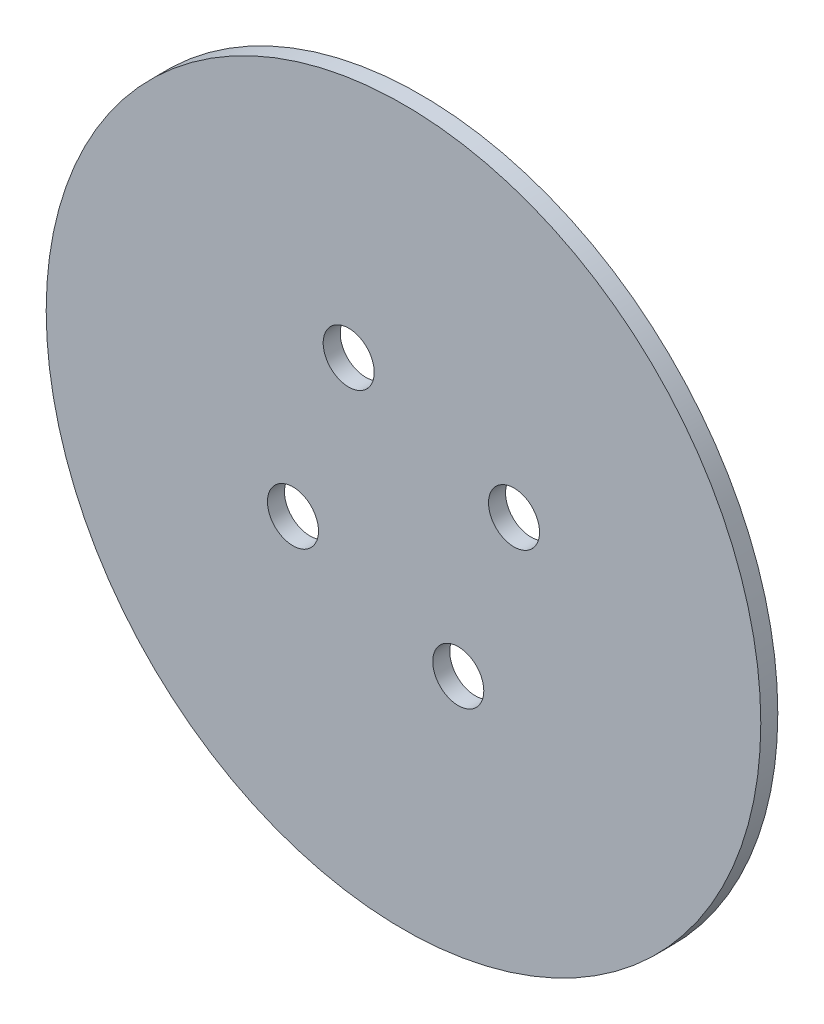
ISO-10303-21;
HEADER;
FILE_DESCRIPTION(('STEP AP214'),'2;1');
FILE_NAME('part.step','',(''),(''),'','','');
FILE_SCHEMA(('AUTOMOTIVE_DESIGN { 1 0 10303 214 1 1 1 1 }'));
ENDSEC;
DATA;
#1=APPLICATION_CONTEXT('core data for automotive mechanical design processes');
#2=APPLICATION_PROTOCOL_DEFINITION('international standard','automotive_design',2000,#1);
#3=PRODUCT_CONTEXT('',#1,'mechanical');
#4=PRODUCT('Part','Part','',(#3));
#5=PRODUCT_RELATED_PRODUCT_CATEGORY('part','',(#4));
#6=PRODUCT_DEFINITION_FORMATION('','',#4);
#7=PRODUCT_DEFINITION_CONTEXT('part definition',#1,'design');
#8=PRODUCT_DEFINITION('design','',#6,#7);
#9=PRODUCT_DEFINITION_SHAPE('','',#8);
#10=(LENGTH_UNIT() NAMED_UNIT(*) SI_UNIT(.MILLI.,.METRE.));
#11=(NAMED_UNIT(*) PLANE_ANGLE_UNIT() SI_UNIT($,.RADIAN.));
#12=(NAMED_UNIT(*) SI_UNIT($,.STERADIAN.) SOLID_ANGLE_UNIT());
#13=UNCERTAINTY_MEASURE_WITH_UNIT(LENGTH_MEASURE(1.E-05),#10,'distance_accuracy_value','');
#14=(GEOMETRIC_REPRESENTATION_CONTEXT(3) GLOBAL_UNCERTAINTY_ASSIGNED_CONTEXT((#13)) GLOBAL_UNIT_ASSIGNED_CONTEXT((#10,
#11,#12)) REPRESENTATION_CONTEXT('',''));
#15=CARTESIAN_POINT('',(0.,0.,0.));
#16=DIRECTION('',(0.,0.,1.));
#17=DIRECTION('',(1.,0.,0.));
#18=AXIS2_PLACEMENT_3D('',#15,#16,#17);
#19=CARTESIAN_POINT('',(0.,0.,1.));
#20=DIRECTION('',(0.,0.,-1.));
#21=DIRECTION('',(-1.,0.,0.));
#22=AXIS2_PLACEMENT_3D('',#19,#20,#21);
#23=CYLINDRICAL_SURFACE('',#22,21.);
#24=CARTESIAN_POINT('',(0.,0.,1.));
#25=DIRECTION('',(0.,0.,1.));
#26=DIRECTION('',(1.,0.,0.));
#27=AXIS2_PLACEMENT_3D('',#24,#25,#26);
#28=CIRCLE('',#27,21.);
#29=CARTESIAN_POINT('',(21.,0.,1.));
#30=VERTEX_POINT('',#29);
#31=EDGE_CURVE('E10',#30,#30,#28,.T.);
#32=ORIENTED_EDGE('',*,*,#31,.F.);
#33=EDGE_LOOP('',(#32));
#34=FACE_BOUND('',#33,.T.);
#35=CARTESIAN_POINT('',(0.,0.,0.));
#36=DIRECTION('',(0.,0.,1.));
#37=DIRECTION('',(1.,0.,0.));
#38=AXIS2_PLACEMENT_3D('',#35,#36,#37);
#39=CIRCLE('',#38,21.);
#40=CARTESIAN_POINT('',(21.,0.,0.));
#41=VERTEX_POINT('',#40);
#42=EDGE_CURVE('E34',#41,#41,#39,.T.);
#43=ORIENTED_EDGE('',*,*,#42,.T.);
#44=EDGE_LOOP('',(#43));
#45=FACE_BOUND('',#44,.T.);
#46=ADVANCED_FACE('F31',(#34,#45),#23,.T.);
#47=CARTESIAN_POINT('',(0.,0.,1.));
#48=DIRECTION('',(0.,0.,1.));
#49=DIRECTION('',(1.,0.,0.));
#50=AXIS2_PLACEMENT_3D('',#47,#48,#49);
#51=PLANE('',#50);
#52=CARTESIAN_POINT('',(3.2196409225509,-6.49587656361794,1.));
#53=DIRECTION('',(0.,0.,1.));
#54=DIRECTION('',(1.,0.,0.));
#55=AXIS2_PLACEMENT_3D('',#52,#53,#54);
#56=CIRCLE('',#55,1.50000000000522);
#57=CARTESIAN_POINT('',(4.71964092255612,-6.49587656361794,1.));
#58=VERTEX_POINT('',#57);
#59=EDGE_CURVE('E61',#58,#58,#56,.T.);
#60=ORIENTED_EDGE('',*,*,#59,.F.);
#61=EDGE_LOOP('',(#60));
#62=FACE_BOUND('',#61,.T.);
#63=CARTESIAN_POINT('',(-6.49587656362414,-3.21964092254574,1.));
#64=DIRECTION('',(0.,0.,1.));
#65=DIRECTION('',(1.,0.,0.));
#66=AXIS2_PLACEMENT_3D('',#63,#64,#65);
#67=CIRCLE('',#66,1.49999999999743);
#68=CARTESIAN_POINT('',(-4.99587656362671,-3.21964092254574,1.));
#69=VERTEX_POINT('',#68);
#70=EDGE_CURVE('E55',#69,#69,#67,.T.);
#71=ORIENTED_EDGE('',*,*,#70,.F.);
#72=EDGE_LOOP('',(#71));
#73=FACE_BOUND('',#72,.T.);
#74=CARTESIAN_POINT('',(6.4958765636231,3.2196409225571,1.));
#75=DIRECTION('',(0.,0.,1.));
#76=DIRECTION('',(1.,0.,0.));
#77=AXIS2_PLACEMENT_3D('',#74,#75,#76);
#78=CIRCLE('',#77,1.50000000000259);
#79=CARTESIAN_POINT('',(7.99587656362569,3.2196409225571,1.));
#80=VERTEX_POINT('',#79);
#81=EDGE_CURVE('E49',#80,#80,#78,.T.);
#82=ORIENTED_EDGE('',*,*,#81,.F.);
#83=EDGE_LOOP('',(#82));
#84=FACE_BOUND('',#83,.T.);
#85=CARTESIAN_POINT('',(-3.21964092255213,6.49587656362965,1.));
#86=DIRECTION('',(0.,0.,1.));
#87=DIRECTION('',(1.,0.,0.));
#88=AXIS2_PLACEMENT_3D('',#85,#86,#87);
#89=CIRCLE('',#88,1.49999999999448);
#90=CARTESIAN_POINT('',(-1.71964092255765,6.49587656362965,1.));
#91=VERTEX_POINT('',#90);
#92=EDGE_CURVE('E43',#91,#91,#89,.T.);
#93=ORIENTED_EDGE('',*,*,#92,.F.);
#94=EDGE_LOOP('',(#93));
#95=FACE_BOUND('',#94,.T.);
#96=ORIENTED_EDGE('',*,*,#31,.T.);
#97=EDGE_LOOP('',(#96));
#98=FACE_BOUND('',#97,.T.);
#99=ADVANCED_FACE('F77',(#62,#73,#84,#95,#98),#51,.T.);
#100=CARTESIAN_POINT('',(0.,0.,0.));
#101=DIRECTION('',(0.,0.,1.));
#102=DIRECTION('',(1.,0.,0.));
#103=AXIS2_PLACEMENT_3D('',#100,#101,#102);
#104=PLANE('',#103);
#105=CARTESIAN_POINT('',(3.2196409225509,-6.49587656361794,0.));
#106=DIRECTION('',(0.,0.,1.));
#107=DIRECTION('',(1.,0.,0.));
#108=AXIS2_PLACEMENT_3D('',#105,#106,#107);
#109=CIRCLE('',#108,1.50000000000522);
#110=CARTESIAN_POINT('',(4.71964092255612,-6.49587656361794,0.));
#111=VERTEX_POINT('',#110);
#112=EDGE_CURVE('E58',#111,#111,#109,.T.);
#113=ORIENTED_EDGE('',*,*,#112,.T.);
#114=EDGE_LOOP('',(#113));
#115=FACE_BOUND('',#114,.T.);
#116=CARTESIAN_POINT('',(-6.49587656362414,-3.21964092254574,0.));
#117=DIRECTION('',(0.,0.,1.));
#118=DIRECTION('',(1.,0.,0.));
#119=AXIS2_PLACEMENT_3D('',#116,#117,#118);
#120=CIRCLE('',#119,1.49999999999743);
#121=CARTESIAN_POINT('',(-4.99587656362671,-3.21964092254574,0.));
#122=VERTEX_POINT('',#121);
#123=EDGE_CURVE('E52',#122,#122,#120,.T.);
#124=ORIENTED_EDGE('',*,*,#123,.T.);
#125=EDGE_LOOP('',(#124));
#126=FACE_BOUND('',#125,.T.);
#127=CARTESIAN_POINT('',(6.4958765636231,3.2196409225571,0.));
#128=DIRECTION('',(0.,0.,1.));
#129=DIRECTION('',(1.,0.,0.));
#130=AXIS2_PLACEMENT_3D('',#127,#128,#129);
#131=CIRCLE('',#130,1.50000000000259);
#132=CARTESIAN_POINT('',(7.99587656362569,3.2196409225571,0.));
#133=VERTEX_POINT('',#132);
#134=EDGE_CURVE('E46',#133,#133,#131,.T.);
#135=ORIENTED_EDGE('',*,*,#134,.T.);
#136=EDGE_LOOP('',(#135));
#137=FACE_BOUND('',#136,.T.);
#138=CARTESIAN_POINT('',(-3.21964092255213,6.49587656362965,0.));
#139=DIRECTION('',(0.,0.,1.));
#140=DIRECTION('',(1.,0.,0.));
#141=AXIS2_PLACEMENT_3D('',#138,#139,#140);
#142=CIRCLE('',#141,1.49999999999448);
#143=CARTESIAN_POINT('',(-1.71964092255765,6.49587656362965,0.));
#144=VERTEX_POINT('',#143);
#145=EDGE_CURVE('E41',#144,#144,#142,.T.);
#146=ORIENTED_EDGE('',*,*,#145,.T.);
#147=EDGE_LOOP('',(#146));
#148=FACE_BOUND('',#147,.T.);
#149=ORIENTED_EDGE('',*,*,#42,.F.);
#150=EDGE_LOOP('',(#149));
#151=FACE_BOUND('',#150,.T.);
#152=ADVANCED_FACE('F67',(#115,#126,#137,#148,#151),#104,.F.);
#153=CARTESIAN_POINT('',(-3.21964092255213,6.49587656362965,0.));
#154=DIRECTION('',(0.,0.,1.));
#155=DIRECTION('',(1.,0.,0.));
#156=AXIS2_PLACEMENT_3D('',#153,#154,#155);
#157=CYLINDRICAL_SURFACE('',#156,1.49999999999448);
#158=ORIENTED_EDGE('',*,*,#145,.F.);
#159=EDGE_LOOP('',(#158));
#160=FACE_BOUND('',#159,.T.);
#161=ORIENTED_EDGE('',*,*,#92,.T.);
#162=EDGE_LOOP('',(#161));
#163=FACE_BOUND('',#162,.T.);
#164=ADVANCED_FACE('F87',(#160,#163),#157,.F.);
#165=CARTESIAN_POINT('',(6.4958765636231,3.2196409225571,0.));
#166=DIRECTION('',(0.,0.,1.));
#167=DIRECTION('',(1.,0.,0.));
#168=AXIS2_PLACEMENT_3D('',#165,#166,#167);
#169=CYLINDRICAL_SURFACE('',#168,1.50000000000259);
#170=ORIENTED_EDGE('',*,*,#134,.F.);
#171=EDGE_LOOP('',(#170));
#172=FACE_BOUND('',#171,.T.);
#173=ORIENTED_EDGE('',*,*,#81,.T.);
#174=EDGE_LOOP('',(#173));
#175=FACE_BOUND('',#174,.T.);
#176=ADVANCED_FACE('F89',(#172,#175),#169,.F.);
#177=CARTESIAN_POINT('',(-6.49587656362414,-3.21964092254574,0.));
#178=DIRECTION('',(0.,0.,1.));
#179=DIRECTION('',(1.,0.,0.));
#180=AXIS2_PLACEMENT_3D('',#177,#178,#179);
#181=CYLINDRICAL_SURFACE('',#180,1.49999999999743);
#182=ORIENTED_EDGE('',*,*,#123,.F.);
#183=EDGE_LOOP('',(#182));
#184=FACE_BOUND('',#183,.T.);
#185=ORIENTED_EDGE('',*,*,#70,.T.);
#186=EDGE_LOOP('',(#185));
#187=FACE_BOUND('',#186,.T.);
#188=ADVANCED_FACE('F73',(#184,#187),#181,.F.);
#189=CARTESIAN_POINT('',(3.2196409225509,-6.49587656361794,0.));
#190=DIRECTION('',(0.,0.,1.));
#191=DIRECTION('',(1.,0.,0.));
#192=AXIS2_PLACEMENT_3D('',#189,#190,#191);
#193=CYLINDRICAL_SURFACE('',#192,1.50000000000522);
#194=ORIENTED_EDGE('',*,*,#112,.F.);
#195=EDGE_LOOP('',(#194));
#196=FACE_BOUND('',#195,.T.);
#197=ORIENTED_EDGE('',*,*,#59,.T.);
#198=EDGE_LOOP('',(#197));
#199=FACE_BOUND('',#198,.T.);
#200=ADVANCED_FACE('F70',(#196,#199),#193,.F.);
#201=CLOSED_SHELL('',(#46,#99,#152,#164,#176,#188,#200));
#202=MANIFOLD_SOLID_BREP('B2',#201);
#203=ADVANCED_BREP_SHAPE_REPRESENTATION('',(#18,#202),#14);
#204=SHAPE_DEFINITION_REPRESENTATION(#9,#203);
ENDSEC;
END-ISO-10303-21;
